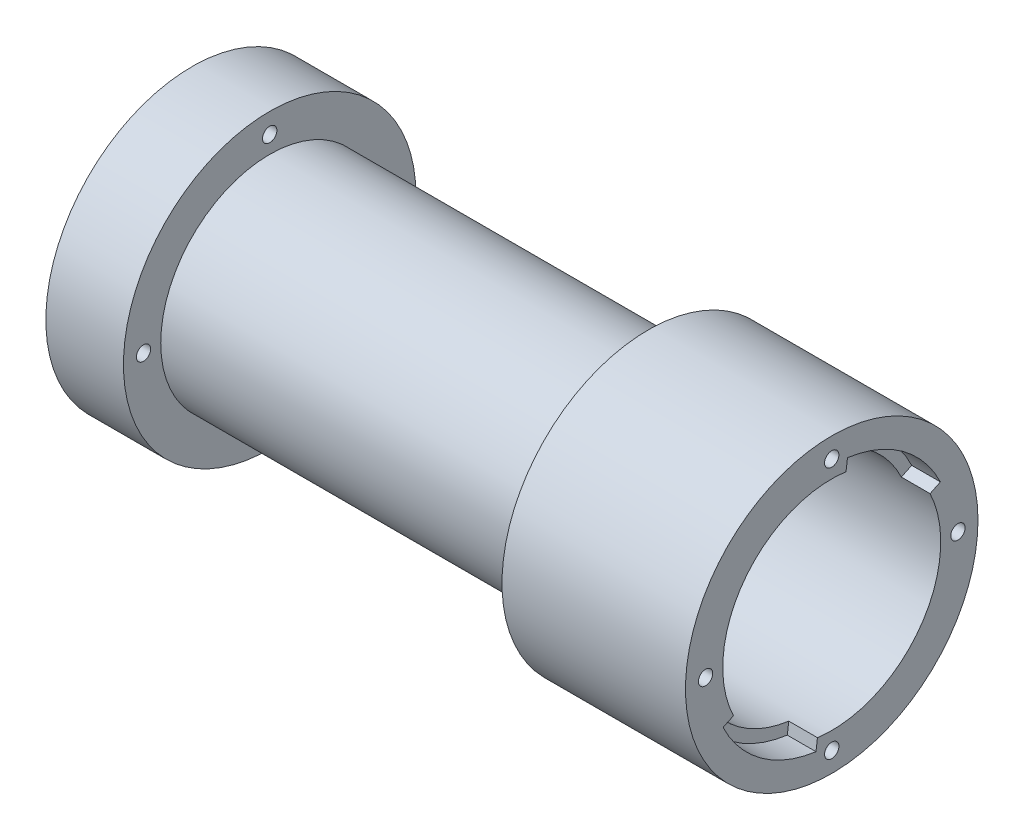
ISO-10303-21;
HEADER;
FILE_DESCRIPTION(('STEP AP214'),'2;1');
FILE_NAME('part.step','',(''),(''),'','','');
FILE_SCHEMA(('AUTOMOTIVE_DESIGN { 1 0 10303 214 1 1 1 1 }'));
ENDSEC;
DATA;
#1=APPLICATION_CONTEXT('core data for automotive mechanical design processes');
#2=APPLICATION_PROTOCOL_DEFINITION('international standard','automotive_design',2000,#1);
#3=PRODUCT_CONTEXT('',#1,'mechanical');
#4=PRODUCT('Part','Part','',(#3));
#5=PRODUCT_RELATED_PRODUCT_CATEGORY('part','',(#4));
#6=PRODUCT_DEFINITION_FORMATION('','',#4);
#7=PRODUCT_DEFINITION_CONTEXT('part definition',#1,'design');
#8=PRODUCT_DEFINITION('design','',#6,#7);
#9=PRODUCT_DEFINITION_SHAPE('','',#8);
#10=(LENGTH_UNIT() NAMED_UNIT(*) SI_UNIT(.MILLI.,.METRE.));
#11=(NAMED_UNIT(*) PLANE_ANGLE_UNIT() SI_UNIT($,.RADIAN.));
#12=(NAMED_UNIT(*) SI_UNIT($,.STERADIAN.) SOLID_ANGLE_UNIT());
#13=UNCERTAINTY_MEASURE_WITH_UNIT(LENGTH_MEASURE(1.E-05),#10,'distance_accuracy_value','');
#14=(GEOMETRIC_REPRESENTATION_CONTEXT(3) GLOBAL_UNCERTAINTY_ASSIGNED_CONTEXT((#13)) GLOBAL_UNIT_ASSIGNED_CONTEXT((#10,
#11,#12)) REPRESENTATION_CONTEXT('',''));
#15=CARTESIAN_POINT('',(0.,0.,0.));
#16=DIRECTION('',(0.,0.,1.));
#17=DIRECTION('',(1.,0.,0.));
#18=AXIS2_PLACEMENT_3D('',#15,#16,#17);
#19=CARTESIAN_POINT('',(213.98,0.,0.));
#20=DIRECTION('',(1.,0.,0.));
#21=DIRECTION('',(0.,0.,-1.));
#22=AXIS2_PLACEMENT_3D('',#19,#20,#21);
#23=PLANE('',#22);
#24=DIRECTION('',(0.,0.431627095776426,-0.902052132746));
#25=VECTOR('',#24,1.);
#26=CARTESIAN_POINT('',(213.98,16.4018296395042,-34.277981044348));
#27=LINE('',#26,#25);
#28=CARTESIAN_POINT('',(213.98,16.4018296395042,-34.277981044348));
#29=VERTEX_POINT('',#28);
#30=CARTESIAN_POINT('',(213.98,18.1283380226099,-37.886189575332));
#31=VERTEX_POINT('',#30);
#32=EDGE_CURVE('E134',#29,#31,#27,.T.);
#33=ORIENTED_EDGE('',*,*,#32,.F.);
#34=CARTESIAN_POINT('',(213.98,0.,0.));
#35=DIRECTION('',(1.,0.,0.));
#36=DIRECTION('',(0.,0.,-1.));
#37=AXIS2_PLACEMENT_3D('',#34,#35,#36);
#38=CIRCLE('',#37,38.);
#39=CARTESIAN_POINT('',(213.98,-37.6723908833809,4.9790526337609));
#40=VERTEX_POINT('',#39);
#41=EDGE_CURVE('E186',#40,#29,#38,.T.);
#42=ORIENTED_EDGE('',*,*,#41,.F.);
#43=DIRECTION('',(0.,0.991378707457392,-0.131027700888445));
#44=VECTOR('',#43,1.);
#45=CARTESIAN_POINT('',(213.98,-37.6723908833809,4.9790526337609));
#46=LINE('',#45,#44);
#47=CARTESIAN_POINT('',(213.98,-41.6379057132105,5.50316343731468));
#48=VERTEX_POINT('',#47);
#49=EDGE_CURVE('E160',#48,#40,#46,.T.);
#50=ORIENTED_EDGE('',*,*,#49,.F.);
#51=CARTESIAN_POINT('',(213.98,0.,0.));
#52=DIRECTION('',(1.,0.,0.));
#53=DIRECTION('',(0.,0.,1.));
#54=AXIS2_PLACEMENT_3D('',#51,#52,#53);
#55=CIRCLE('',#54,42.);
#56=CARTESIAN_POINT('',(213.98,-18.1283380226064,37.8861895753337));
#57=VERTEX_POINT('',#56);
#58=EDGE_CURVE('E152',#57,#48,#55,.T.);
#59=ORIENTED_EDGE('',*,*,#58,.F.);
#60=DIRECTION('',(0.,-0.431627095776342,0.90205213274604));
#61=VECTOR('',#60,1.);
#62=CARTESIAN_POINT('',(213.98,-16.401829639501,34.2779810443496));
#63=LINE('',#62,#61);
#64=CARTESIAN_POINT('',(213.98,-16.401829639501,34.2779810443496));
#65=VERTEX_POINT('',#64);
#66=EDGE_CURVE('E162',#65,#57,#63,.T.);
#67=ORIENTED_EDGE('',*,*,#66,.F.);
#68=CARTESIAN_POINT('',(213.98,37.6723908833813,-4.97905263375742));
#69=VERTEX_POINT('',#68);
#70=EDGE_CURVE('E189',#69,#65,#38,.T.);
#71=ORIENTED_EDGE('',*,*,#70,.F.);
#72=DIRECTION('',(0.,-0.991378707457404,0.131027700888353));
#73=VECTOR('',#72,1.);
#74=CARTESIAN_POINT('',(213.98,37.6723908833813,-4.97905263375742));
#75=LINE('',#74,#73);
#76=CARTESIAN_POINT('',(213.98,41.6379057132109,-5.50316343731083));
#77=VERTEX_POINT('',#76);
#78=EDGE_CURVE('E139',#77,#69,#75,.T.);
#79=ORIENTED_EDGE('',*,*,#78,.F.);
#80=CARTESIAN_POINT('',(213.98,0.,0.));
#81=DIRECTION('',(1.,0.,0.));
#82=DIRECTION('',(0.,0.,1.));
#83=AXIS2_PLACEMENT_3D('',#80,#81,#82);
#84=CIRCLE('',#83,42.);
#85=EDGE_CURVE('E119',#31,#77,#84,.T.);
#86=ORIENTED_EDGE('',*,*,#85,.F.);
#87=EDGE_LOOP('',(#33,#42,#50,#59,#67,#71,#79,#86));
#88=FACE_BOUND('',#87,.T.);
#89=CARTESIAN_POINT('',(213.98,44.,0.));
#90=DIRECTION('',(1.,0.,0.));
#91=DIRECTION('',(0.,0.,-1.));
#92=AXIS2_PLACEMENT_3D('',#89,#90,#91);
#93=CIRCLE('',#92,2.50000000000249);
#94=CARTESIAN_POINT('',(213.98,44.,-2.50000000000249));
#95=VERTEX_POINT('',#94);
#96=EDGE_CURVE('E174',#95,#95,#93,.F.);
#97=ORIENTED_EDGE('',*,*,#96,.T.);
#98=EDGE_LOOP('',(#97));
#99=FACE_BOUND('',#98,.T.);
#100=CARTESIAN_POINT('',(213.98,1.15794220585168E-12,44.0000000000012));
#101=DIRECTION('',(1.,0.,0.));
#102=DIRECTION('',(0.,0.,-1.));
#103=AXIS2_PLACEMENT_3D('',#100,#101,#102);
#104=CIRCLE('',#103,2.50000000000249);
#105=CARTESIAN_POINT('',(213.98,1.15794220585168E-12,41.4999999999987));
#106=VERTEX_POINT('',#105);
#107=EDGE_CURVE('E178',#106,#106,#104,.F.);
#108=ORIENTED_EDGE('',*,*,#107,.T.);
#109=EDGE_LOOP('',(#108));
#110=FACE_BOUND('',#109,.T.);
#111=CARTESIAN_POINT('',(213.98,-44.,2.31588441170336E-12));
#112=DIRECTION('',(1.,0.,0.));
#113=DIRECTION('',(0.,0.,-1.));
#114=AXIS2_PLACEMENT_3D('',#111,#112,#113);
#115=CIRCLE('',#114,2.50000000000249);
#116=CARTESIAN_POINT('',(213.98,-44.,-2.50000000000018));
#117=VERTEX_POINT('',#116);
#118=EDGE_CURVE('E181',#117,#117,#115,.F.);
#119=ORIENTED_EDGE('',*,*,#118,.T.);
#120=EDGE_LOOP('',(#119));
#121=FACE_BOUND('',#120,.T.);
#122=CARTESIAN_POINT('',(213.98,-1.16333065176793E-12,-43.9999999999988));
#123=DIRECTION('',(1.,0.,0.));
#124=DIRECTION('',(0.,0.,-1.));
#125=AXIS2_PLACEMENT_3D('',#122,#123,#124);
#126=CIRCLE('',#125,2.50000000000248);
#127=CARTESIAN_POINT('',(213.98,-1.16333065176793E-12,-46.5000000000013));
#128=VERTEX_POINT('',#127);
#129=EDGE_CURVE('E146',#128,#128,#126,.F.);
#130=ORIENTED_EDGE('',*,*,#129,.T.);
#131=EDGE_LOOP('',(#130));
#132=FACE_BOUND('',#131,.T.);
#133=CARTESIAN_POINT('',(213.98,0.,0.));
#134=DIRECTION('',(1.,0.,0.));
#135=DIRECTION('',(0.,0.,-1.));
#136=AXIS2_PLACEMENT_3D('',#133,#134,#135);
#137=CIRCLE('',#136,51.);
#138=CARTESIAN_POINT('',(213.98,0.,-51.));
#139=VERTEX_POINT('',#138);
#140=EDGE_CURVE('E12',#139,#139,#137,.T.);
#141=ORIENTED_EDGE('',*,*,#140,.T.);
#142=EDGE_LOOP('',(#141));
#143=FACE_BOUND('',#142,.T.);
#144=ADVANCED_FACE('F46',(#88,#99,#110,#121,#132,#143),#23,.T.);
#145=CARTESIAN_POINT('',(150.,0.,0.));
#146=DIRECTION('',(1.,0.,0.));
#147=DIRECTION('',(0.,0.,-1.));
#148=AXIS2_PLACEMENT_3D('',#145,#146,#147);
#149=PLANE('',#148);
#150=CARTESIAN_POINT('',(150.,44.,0.));
#151=DIRECTION('',(1.,0.,0.));
#152=DIRECTION('',(0.,0.,-1.));
#153=AXIS2_PLACEMENT_3D('',#150,#151,#152);
#154=CIRCLE('',#153,2.50000000000249);
#155=CARTESIAN_POINT('',(150.,44.,-2.50000000000249));
#156=VERTEX_POINT('',#155);
#157=EDGE_CURVE('E50',#156,#156,#154,.T.);
#158=ORIENTED_EDGE('',*,*,#157,.T.);
#159=EDGE_LOOP('',(#158));
#160=FACE_BOUND('',#159,.T.);
#161=CARTESIAN_POINT('',(150.,1.15794220585168E-12,44.0000000000012));
#162=DIRECTION('',(1.,0.,0.));
#163=DIRECTION('',(0.,0.,-1.));
#164=AXIS2_PLACEMENT_3D('',#161,#162,#163);
#165=CIRCLE('',#164,2.50000000000249);
#166=CARTESIAN_POINT('',(150.,1.15794220585168E-12,41.4999999999987));
#167=VERTEX_POINT('',#166);
#168=EDGE_CURVE('E199',#167,#167,#165,.T.);
#169=ORIENTED_EDGE('',*,*,#168,.T.);
#170=EDGE_LOOP('',(#169));
#171=FACE_BOUND('',#170,.T.);
#172=CARTESIAN_POINT('',(150.,-44.,2.31588441170336E-12));
#173=DIRECTION('',(1.,0.,0.));
#174=DIRECTION('',(0.,0.,-1.));
#175=AXIS2_PLACEMENT_3D('',#172,#173,#174);
#176=CIRCLE('',#175,2.50000000000249);
#177=CARTESIAN_POINT('',(150.,-44.,-2.50000000000018));
#178=VERTEX_POINT('',#177);
#179=EDGE_CURVE('E197',#178,#178,#176,.T.);
#180=ORIENTED_EDGE('',*,*,#179,.T.);
#181=EDGE_LOOP('',(#180));
#182=FACE_BOUND('',#181,.T.);
#183=CARTESIAN_POINT('',(150.,-1.16333065176793E-12,-43.9999999999988));
#184=DIRECTION('',(1.,0.,0.));
#185=DIRECTION('',(0.,0.,-1.));
#186=AXIS2_PLACEMENT_3D('',#183,#184,#185);
#187=CIRCLE('',#186,2.50000000000248);
#188=CARTESIAN_POINT('',(150.,-1.16333065176793E-12,-46.5000000000013));
#189=VERTEX_POINT('',#188);
#190=EDGE_CURVE('E177',#189,#189,#187,.T.);
#191=ORIENTED_EDGE('',*,*,#190,.T.);
#192=EDGE_LOOP('',(#191));
#193=FACE_BOUND('',#192,.T.);
#194=CARTESIAN_POINT('',(150.,0.,0.));
#195=DIRECTION('',(1.,0.,0.));
#196=DIRECTION('',(0.,0.,-1.));
#197=AXIS2_PLACEMENT_3D('',#194,#195,#196);
#198=CIRCLE('',#197,51.);
#199=CARTESIAN_POINT('',(150.,0.,-51.));
#200=VERTEX_POINT('',#199);
#201=EDGE_CURVE('E55',#200,#200,#198,.T.);
#202=ORIENTED_EDGE('',*,*,#201,.F.);
#203=EDGE_LOOP('',(#202));
#204=FACE_BOUND('',#203,.T.);
#205=CARTESIAN_POINT('',(150.,0.,0.));
#206=DIRECTION('',(1.,0.,0.));
#207=DIRECTION('',(0.,0.,-1.));
#208=AXIS2_PLACEMENT_3D('',#205,#206,#207);
#209=CIRCLE('',#208,38.);
#210=CARTESIAN_POINT('',(150.,0.,-38.));
#211=VERTEX_POINT('',#210);
#212=EDGE_CURVE('E190',#211,#211,#209,.T.);
#213=ORIENTED_EDGE('',*,*,#212,.T.);
#214=EDGE_LOOP('',(#213));
#215=FACE_BOUND('',#214,.T.);
#216=ADVANCED_FACE('F206',(#160,#171,#182,#193,#204,#215),#149,.F.);
#217=CARTESIAN_POINT('',(213.98,0.,0.));
#218=DIRECTION('',(-1.,0.,0.));
#219=DIRECTION('',(0.,0.,1.));
#220=AXIS2_PLACEMENT_3D('',#217,#218,#219);
#221=CYLINDRICAL_SURFACE('',#220,51.);
#222=ORIENTED_EDGE('',*,*,#140,.F.);
#223=EDGE_LOOP('',(#222));
#224=FACE_BOUND('',#223,.T.);
#225=ORIENTED_EDGE('',*,*,#201,.T.);
#226=EDGE_LOOP('',(#225));
#227=FACE_BOUND('',#226,.T.);
#228=ADVANCED_FACE('F48',(#224,#227),#221,.T.);
#229=CARTESIAN_POINT('',(213.98,0.,0.));
#230=DIRECTION('',(-1.,0.,0.));
#231=DIRECTION('',(0.,0.,1.));
#232=AXIS2_PLACEMENT_3D('',#229,#230,#231);
#233=CYLINDRICAL_SURFACE('',#232,38.);
#234=DIRECTION('',(1.,0.,0.));
#235=VECTOR('',#234,1.);
#236=CARTESIAN_POINT('',(203.98,16.4018296395042,-34.277981044348));
#237=LINE('',#236,#235);
#238=CARTESIAN_POINT('',(203.98,16.4018296395042,-34.277981044348));
#239=VERTEX_POINT('',#238);
#240=EDGE_CURVE('E147',#239,#29,#237,.T.);
#241=ORIENTED_EDGE('',*,*,#240,.F.);
#242=CARTESIAN_POINT('',(203.98,0.,0.));
#243=DIRECTION('',(-1.,0.,0.));
#244=DIRECTION('',(0.,0.,-1.));
#245=AXIS2_PLACEMENT_3D('',#242,#243,#244);
#246=CIRCLE('',#245,38.);
#247=CARTESIAN_POINT('',(203.98,37.6723908833813,-4.97905263375742));
#248=VERTEX_POINT('',#247);
#249=EDGE_CURVE('E128',#248,#239,#246,.T.);
#250=ORIENTED_EDGE('',*,*,#249,.F.);
#251=DIRECTION('',(1.,0.,0.));
#252=VECTOR('',#251,1.);
#253=CARTESIAN_POINT('',(203.98,37.6723908833813,-4.97905263375742));
#254=LINE('',#253,#252);
#255=EDGE_CURVE('E122',#248,#69,#254,.T.);
#256=ORIENTED_EDGE('',*,*,#255,.T.);
#257=ORIENTED_EDGE('',*,*,#70,.T.);
#258=DIRECTION('',(1.,0.,0.));
#259=VECTOR('',#258,1.);
#260=CARTESIAN_POINT('',(203.98,-16.401829639501,34.2779810443496));
#261=LINE('',#260,#259);
#262=CARTESIAN_POINT('',(203.98,-16.401829639501,34.2779810443496));
#263=VERTEX_POINT('',#262);
#264=EDGE_CURVE('E167',#263,#65,#261,.T.);
#265=ORIENTED_EDGE('',*,*,#264,.F.);
#266=CARTESIAN_POINT('',(203.98,0.,0.));
#267=DIRECTION('',(-1.,0.,0.));
#268=DIRECTION('',(0.,0.,-1.));
#269=AXIS2_PLACEMENT_3D('',#266,#267,#268);
#270=CIRCLE('',#269,38.);
#271=CARTESIAN_POINT('',(203.98,-37.6723908833809,4.9790526337609));
#272=VERTEX_POINT('',#271);
#273=EDGE_CURVE('E154',#272,#263,#270,.T.);
#274=ORIENTED_EDGE('',*,*,#273,.F.);
#275=DIRECTION('',(1.,0.,0.));
#276=VECTOR('',#275,1.);
#277=CARTESIAN_POINT('',(203.98,-37.6723908833809,4.9790526337609));
#278=LINE('',#277,#276);
#279=EDGE_CURVE('E169',#272,#40,#278,.T.);
#280=ORIENTED_EDGE('',*,*,#279,.T.);
#281=ORIENTED_EDGE('',*,*,#41,.T.);
#282=EDGE_LOOP('',(#241,#250,#256,#257,#265,#274,#280,#281));
#283=FACE_BOUND('',#282,.T.);
#284=ORIENTED_EDGE('',*,*,#212,.F.);
#285=EDGE_LOOP('',(#284));
#286=FACE_BOUND('',#285,.T.);
#287=ADVANCED_FACE('F235',(#283,#286),#233,.F.);
#288=CARTESIAN_POINT('',(221.051067811873,-1.16333065176793E-12,-43.9999999999988));
#289=DIRECTION('',(-1.,0.,0.));
#290=DIRECTION('',(0.,0.,1.));
#291=AXIS2_PLACEMENT_3D('',#288,#289,#290);
#292=CYLINDRICAL_SURFACE('',#291,2.50000000000248);
#293=ORIENTED_EDGE('',*,*,#129,.F.);
#294=EDGE_LOOP('',(#293));
#295=FACE_BOUND('',#294,.T.);
#296=ORIENTED_EDGE('',*,*,#190,.F.);
#297=EDGE_LOOP('',(#296));
#298=FACE_BOUND('',#297,.T.);
#299=ADVANCED_FACE('F238',(#295,#298),#292,.F.);
#300=CARTESIAN_POINT('',(221.051067811873,-44.,2.31588441170336E-12));
#301=DIRECTION('',(-1.,0.,0.));
#302=DIRECTION('',(0.,0.,1.));
#303=AXIS2_PLACEMENT_3D('',#300,#301,#302);
#304=CYLINDRICAL_SURFACE('',#303,2.50000000000249);
#305=ORIENTED_EDGE('',*,*,#118,.F.);
#306=EDGE_LOOP('',(#305));
#307=FACE_BOUND('',#306,.T.);
#308=ORIENTED_EDGE('',*,*,#179,.F.);
#309=EDGE_LOOP('',(#308));
#310=FACE_BOUND('',#309,.T.);
#311=ADVANCED_FACE('F221',(#307,#310),#304,.F.);
#312=CARTESIAN_POINT('',(221.051067811873,1.15794220585168E-12,44.0000000000012));
#313=DIRECTION('',(-1.,0.,0.));
#314=DIRECTION('',(0.,0.,1.));
#315=AXIS2_PLACEMENT_3D('',#312,#313,#314);
#316=CYLINDRICAL_SURFACE('',#315,2.50000000000249);
#317=ORIENTED_EDGE('',*,*,#107,.F.);
#318=EDGE_LOOP('',(#317));
#319=FACE_BOUND('',#318,.T.);
#320=ORIENTED_EDGE('',*,*,#168,.F.);
#321=EDGE_LOOP('',(#320));
#322=FACE_BOUND('',#321,.T.);
#323=ADVANCED_FACE('F211',(#319,#322),#316,.F.);
#324=CARTESIAN_POINT('',(221.051067811873,44.,0.));
#325=DIRECTION('',(-1.,0.,0.));
#326=DIRECTION('',(0.,0.,1.));
#327=AXIS2_PLACEMENT_3D('',#324,#325,#326);
#328=CYLINDRICAL_SURFACE('',#327,2.50000000000249);
#329=ORIENTED_EDGE('',*,*,#96,.F.);
#330=EDGE_LOOP('',(#329));
#331=FACE_BOUND('',#330,.T.);
#332=ORIENTED_EDGE('',*,*,#157,.F.);
#333=EDGE_LOOP('',(#332));
#334=FACE_BOUND('',#333,.T.);
#335=ADVANCED_FACE('F208',(#331,#334),#328,.F.);
#336=CARTESIAN_POINT('',(203.98,0.,0.));
#337=DIRECTION('',(1.,0.,0.));
#338=DIRECTION('',(0.,0.,-1.));
#339=AXIS2_PLACEMENT_3D('',#336,#337,#338);
#340=CYLINDRICAL_SURFACE('',#339,42.);
#341=ORIENTED_EDGE('',*,*,#58,.T.);
#342=DIRECTION('',(1.,0.,0.));
#343=VECTOR('',#342,1.);
#344=CARTESIAN_POINT('',(203.98,-41.6379057132105,5.50316343731468));
#345=LINE('',#344,#343);
#346=CARTESIAN_POINT('',(203.98,-41.6379057132105,5.50316343731468));
#347=VERTEX_POINT('',#346);
#348=EDGE_CURVE('E159',#347,#48,#345,.T.);
#349=ORIENTED_EDGE('',*,*,#348,.F.);
#350=CARTESIAN_POINT('',(203.98,0.,0.));
#351=DIRECTION('',(1.,0.,0.));
#352=DIRECTION('',(0.,0.,-1.));
#353=AXIS2_PLACEMENT_3D('',#350,#351,#352);
#354=CIRCLE('',#353,42.);
#355=CARTESIAN_POINT('',(203.98,-18.1283380226064,37.8861895753337));
#356=VERTEX_POINT('',#355);
#357=EDGE_CURVE('E150',#356,#347,#354,.T.);
#358=ORIENTED_EDGE('',*,*,#357,.F.);
#359=DIRECTION('',(1.,0.,0.));
#360=VECTOR('',#359,1.);
#361=CARTESIAN_POINT('',(203.98,-18.1283380226064,37.8861895753337));
#362=LINE('',#361,#360);
#363=EDGE_CURVE('E141',#356,#57,#362,.T.);
#364=ORIENTED_EDGE('',*,*,#363,.T.);
#365=EDGE_LOOP('',(#341,#349,#358,#364));
#366=FACE_BOUND('',#365,.T.);
#367=ADVANCED_FACE('F210',(#366),#340,.F.);
#368=CARTESIAN_POINT('',(203.98,-16.401829639501,34.2779810443496));
#369=DIRECTION('',(0.,0.902052132746041,0.431627095776342));
#370=DIRECTION('',(0.,-0.431627095776342,0.902052132746041));
#371=AXIS2_PLACEMENT_3D('',#368,#369,#370);
#372=PLANE('',#371);
#373=ORIENTED_EDGE('',*,*,#66,.T.);
#374=ORIENTED_EDGE('',*,*,#363,.F.);
#375=DIRECTION('',(0.,-0.431627095776342,0.90205213274604));
#376=VECTOR('',#375,1.);
#377=CARTESIAN_POINT('',(203.98,-16.401829639501,34.2779810443496));
#378=LINE('',#377,#376);
#379=EDGE_CURVE('E156',#263,#356,#378,.T.);
#380=ORIENTED_EDGE('',*,*,#379,.F.);
#381=ORIENTED_EDGE('',*,*,#264,.T.);
#382=EDGE_LOOP('',(#373,#374,#380,#381));
#383=FACE_BOUND('',#382,.T.);
#384=ADVANCED_FACE('F218',(#383),#372,.F.);
#385=CARTESIAN_POINT('',(203.98,-37.6723908833809,4.9790526337609));
#386=DIRECTION('',(0.,-0.131027700888445,-0.991378707457392));
#387=DIRECTION('',(0.,0.991378707457392,-0.131027700888445));
#388=AXIS2_PLACEMENT_3D('',#385,#386,#387);
#389=PLANE('',#388);
#390=ORIENTED_EDGE('',*,*,#49,.T.);
#391=ORIENTED_EDGE('',*,*,#279,.F.);
#392=DIRECTION('',(0.,0.991378707457392,-0.131027700888445));
#393=VECTOR('',#392,1.);
#394=CARTESIAN_POINT('',(203.98,-37.6723908833809,4.9790526337609));
#395=LINE('',#394,#393);
#396=EDGE_CURVE('E71',#347,#272,#395,.T.);
#397=ORIENTED_EDGE('',*,*,#396,.F.);
#398=ORIENTED_EDGE('',*,*,#348,.T.);
#399=EDGE_LOOP('',(#390,#391,#397,#398));
#400=FACE_BOUND('',#399,.T.);
#401=ADVANCED_FACE('F322',(#400),#389,.F.);
#402=CARTESIAN_POINT('',(203.98,0.,0.));
#403=DIRECTION('',(1.,0.,0.));
#404=DIRECTION('',(0.,0.,-1.));
#405=AXIS2_PLACEMENT_3D('',#402,#403,#404);
#406=PLANE('',#405);
#407=ORIENTED_EDGE('',*,*,#357,.T.);
#408=ORIENTED_EDGE('',*,*,#396,.T.);
#409=ORIENTED_EDGE('',*,*,#273,.T.);
#410=ORIENTED_EDGE('',*,*,#379,.T.);
#411=EDGE_LOOP('',(#407,#408,#409,#410));
#412=FACE_BOUND('',#411,.T.);
#413=ADVANCED_FACE('F331',(#412),#406,.T.);
#414=CARTESIAN_POINT('',(203.98,0.,0.));
#415=DIRECTION('',(1.,0.,0.));
#416=DIRECTION('',(0.,0.,-1.));
#417=AXIS2_PLACEMENT_3D('',#414,#415,#416);
#418=CYLINDRICAL_SURFACE('',#417,42.);
#419=ORIENTED_EDGE('',*,*,#85,.T.);
#420=DIRECTION('',(1.,0.,0.));
#421=VECTOR('',#420,1.);
#422=CARTESIAN_POINT('',(203.98,41.6379057132109,-5.50316343731083));
#423=LINE('',#422,#421);
#424=CARTESIAN_POINT('',(203.98,41.6379057132109,-5.50316343731083));
#425=VERTEX_POINT('',#424);
#426=EDGE_CURVE('E114',#425,#77,#423,.T.);
#427=ORIENTED_EDGE('',*,*,#426,.F.);
#428=CARTESIAN_POINT('',(203.98,0.,0.));
#429=DIRECTION('',(1.,0.,0.));
#430=DIRECTION('',(0.,0.,-1.));
#431=AXIS2_PLACEMENT_3D('',#428,#429,#430);
#432=CIRCLE('',#431,42.);
#433=CARTESIAN_POINT('',(203.98,18.1283380226099,-37.886189575332));
#434=VERTEX_POINT('',#433);
#435=EDGE_CURVE('E116',#434,#425,#432,.T.);
#436=ORIENTED_EDGE('',*,*,#435,.F.);
#437=DIRECTION('',(1.,0.,0.));
#438=VECTOR('',#437,1.);
#439=CARTESIAN_POINT('',(203.98,18.1283380226099,-37.886189575332));
#440=LINE('',#439,#438);
#441=EDGE_CURVE('E144',#434,#31,#440,.T.);
#442=ORIENTED_EDGE('',*,*,#441,.T.);
#443=EDGE_LOOP('',(#419,#427,#436,#442));
#444=FACE_BOUND('',#443,.T.);
#445=ADVANCED_FACE('F115',(#444),#418,.F.);
#446=CARTESIAN_POINT('',(203.98,16.4018296395042,-34.277981044348));
#447=DIRECTION('',(0.,-0.902052132746,-0.431627095776426));
#448=DIRECTION('',(0.,0.431627095776426,-0.902052132746));
#449=AXIS2_PLACEMENT_3D('',#446,#447,#448);
#450=PLANE('',#449);
#451=ORIENTED_EDGE('',*,*,#32,.T.);
#452=ORIENTED_EDGE('',*,*,#441,.F.);
#453=DIRECTION('',(0.,0.431627095776426,-0.902052132746));
#454=VECTOR('',#453,1.);
#455=CARTESIAN_POINT('',(203.98,16.4018296395042,-34.277981044348));
#456=LINE('',#455,#454);
#457=EDGE_CURVE('E123',#239,#434,#456,.T.);
#458=ORIENTED_EDGE('',*,*,#457,.F.);
#459=ORIENTED_EDGE('',*,*,#240,.T.);
#460=EDGE_LOOP('',(#451,#452,#458,#459));
#461=FACE_BOUND('',#460,.T.);
#462=ADVANCED_FACE('F346',(#461),#450,.F.);
#463=CARTESIAN_POINT('',(203.98,37.6723908833813,-4.97905263375742));
#464=DIRECTION('',(0.,0.131027700888353,0.991378707457404));
#465=DIRECTION('',(0.,-0.991378707457404,0.131027700888353));
#466=AXIS2_PLACEMENT_3D('',#463,#464,#465);
#467=PLANE('',#466);
#468=ORIENTED_EDGE('',*,*,#78,.T.);
#469=ORIENTED_EDGE('',*,*,#255,.F.);
#470=DIRECTION('',(0.,-0.991378707457404,0.131027700888353));
#471=VECTOR('',#470,1.);
#472=CARTESIAN_POINT('',(203.98,37.6723908833813,-4.97905263375742));
#473=LINE('',#472,#471);
#474=EDGE_CURVE('E63',#425,#248,#473,.T.);
#475=ORIENTED_EDGE('',*,*,#474,.F.);
#476=ORIENTED_EDGE('',*,*,#426,.T.);
#477=EDGE_LOOP('',(#468,#469,#475,#476));
#478=FACE_BOUND('',#477,.T.);
#479=ADVANCED_FACE('F125',(#478),#467,.F.);
#480=CARTESIAN_POINT('',(203.98,0.,0.));
#481=DIRECTION('',(1.,0.,0.));
#482=DIRECTION('',(0.,0.,-1.));
#483=AXIS2_PLACEMENT_3D('',#480,#481,#482);
#484=PLANE('',#483);
#485=ORIENTED_EDGE('',*,*,#435,.T.);
#486=ORIENTED_EDGE('',*,*,#474,.T.);
#487=ORIENTED_EDGE('',*,*,#249,.T.);
#488=ORIENTED_EDGE('',*,*,#457,.T.);
#489=EDGE_LOOP('',(#485,#486,#487,#488));
#490=FACE_BOUND('',#489,.T.);
#491=ADVANCED_FACE('F131',(#490),#484,.T.);
#492=CLOSED_SHELL('',(#144,#216,#228,#287,#299,#311,#323,#335,#367,#384,#401,#413,#445,#462,
#479,#491));
#493=MANIFOLD_SOLID_BREP('B2',#492);
#494=CARTESIAN_POINT('',(150.,0.,0.));
#495=DIRECTION('',(-1.,0.,0.));
#496=DIRECTION('',(0.,0.,1.));
#497=AXIS2_PLACEMENT_3D('',#494,#495,#496);
#498=CYLINDRICAL_SURFACE('',#497,27.);
#499=CARTESIAN_POINT('',(18.,0.,0.));
#500=DIRECTION('',(1.,0.,0.));
#501=DIRECTION('',(0.,0.,-1.));
#502=AXIS2_PLACEMENT_3D('',#499,#500,#501);
#503=CIRCLE('',#502,27.);
#504=CARTESIAN_POINT('',(18.,0.,-27.));
#505=VERTEX_POINT('',#504);
#506=EDGE_CURVE('E432',#505,#505,#503,.T.);
#507=ORIENTED_EDGE('',*,*,#506,.F.);
#508=EDGE_LOOP('',(#507));
#509=FACE_BOUND('',#508,.T.);
#510=CARTESIAN_POINT('',(136.,0.,0.));
#511=DIRECTION('',(1.,0.,0.));
#512=DIRECTION('',(0.,0.,-1.));
#513=AXIS2_PLACEMENT_3D('',#510,#511,#512);
#514=CIRCLE('',#513,27.);
#515=CARTESIAN_POINT('',(136.,0.,-27.));
#516=VERTEX_POINT('',#515);
#517=EDGE_CURVE('E408',#516,#516,#514,.T.);
#518=ORIENTED_EDGE('',*,*,#517,.T.);
#519=EDGE_LOOP('',(#518));
#520=FACE_BOUND('',#519,.T.);
#521=ADVANCED_FACE('F404',(#509,#520),#498,.F.);
#522=CARTESIAN_POINT('',(-9.06,0.,0.));
#523=DIRECTION('',(1.,0.,0.));
#524=DIRECTION('',(0.,0.,-1.));
#525=AXIS2_PLACEMENT_3D('',#522,#523,#524);
#526=CYLINDRICAL_SURFACE('',#525,51.);
#527=CARTESIAN_POINT('',(-9.06,0.,0.));
#528=DIRECTION('',(1.,0.,0.));
#529=DIRECTION('',(0.,0.,-1.));
#530=AXIS2_PLACEMENT_3D('',#527,#528,#529);
#531=CIRCLE('',#530,51.);
#532=CARTESIAN_POINT('',(-9.06,0.,-51.));
#533=VERTEX_POINT('',#532);
#534=EDGE_CURVE('E45',#533,#533,#531,.T.);
#535=ORIENTED_EDGE('',*,*,#534,.T.);
#536=EDGE_LOOP('',(#535));
#537=FACE_BOUND('',#536,.T.);
#538=CARTESIAN_POINT('',(18.,0.,0.));
#539=DIRECTION('',(1.,0.,0.));
#540=DIRECTION('',(0.,0.,-1.));
#541=AXIS2_PLACEMENT_3D('',#538,#539,#540);
#542=CIRCLE('',#541,51.);
#543=CARTESIAN_POINT('',(18.,0.,-51.));
#544=VERTEX_POINT('',#543);
#545=EDGE_CURVE('E417',#544,#544,#542,.T.);
#546=ORIENTED_EDGE('',*,*,#545,.F.);
#547=EDGE_LOOP('',(#546));
#548=FACE_BOUND('',#547,.T.);
#549=ADVANCED_FACE('F406',(#537,#548),#526,.T.);
#550=CARTESIAN_POINT('',(-9.06,0.,0.));
#551=DIRECTION('',(1.,0.,0.));
#552=DIRECTION('',(0.,0.,-1.));
#553=AXIS2_PLACEMENT_3D('',#550,#551,#552);
#554=PLANE('',#553);
#555=CARTESIAN_POINT('',(-9.06,44.,0.));
#556=DIRECTION('',(-1.,0.,0.));
#557=DIRECTION('',(0.,0.,1.));
#558=AXIS2_PLACEMENT_3D('',#555,#556,#557);
#559=CIRCLE('',#558,2.50000000000249);
#560=CARTESIAN_POINT('',(-9.06,44.,2.50000000000249));
#561=VERTEX_POINT('',#560);
#562=EDGE_CURVE('E425',#561,#561,#559,.T.);
#563=ORIENTED_EDGE('',*,*,#562,.F.);
#564=EDGE_LOOP('',(#563));
#565=FACE_BOUND('',#564,.T.);
#566=CARTESIAN_POINT('',(-9.06,1.15794220585168E-12,44.0000000000012));
#567=DIRECTION('',(-1.,0.,0.));
#568=DIRECTION('',(0.,0.,1.));
#569=AXIS2_PLACEMENT_3D('',#566,#567,#568);
#570=CIRCLE('',#569,2.50000000000249);
#571=CARTESIAN_POINT('',(-9.06,1.15794220585168E-12,46.5000000000037));
#572=VERTEX_POINT('',#571);
#573=EDGE_CURVE('E608',#572,#572,#570,.T.);
#574=ORIENTED_EDGE('',*,*,#573,.F.);
#575=EDGE_LOOP('',(#574));
#576=FACE_BOUND('',#575,.T.);
#577=CARTESIAN_POINT('',(-9.06,-44.,2.31588441170336E-12));
#578=DIRECTION('',(-1.,0.,0.));
#579=DIRECTION('',(0.,0.,1.));
#580=AXIS2_PLACEMENT_3D('',#577,#578,#579);
#581=CIRCLE('',#580,2.50000000000249);
#582=CARTESIAN_POINT('',(-9.06,-44.,2.50000000000481));
#583=VERTEX_POINT('',#582);
#584=EDGE_CURVE('E610',#583,#583,#581,.T.);
#585=ORIENTED_EDGE('',*,*,#584,.F.);
#586=EDGE_LOOP('',(#585));
#587=FACE_BOUND('',#586,.T.);
#588=CARTESIAN_POINT('',(-9.06,-1.16333065176793E-12,-43.9999999999988));
#589=DIRECTION('',(-1.,0.,0.));
#590=DIRECTION('',(0.,0.,1.));
#591=AXIS2_PLACEMENT_3D('',#588,#589,#590);
#592=CIRCLE('',#591,2.50000000000248);
#593=CARTESIAN_POINT('',(-9.06,-1.16333065176793E-12,-41.4999999999964));
#594=VERTEX_POINT('',#593);
#595=EDGE_CURVE('E445',#594,#594,#592,.T.);
#596=ORIENTED_EDGE('',*,*,#595,.F.);
#597=EDGE_LOOP('',(#596));
#598=FACE_BOUND('',#597,.T.);
#599=CARTESIAN_POINT('',(-9.06,0.,0.));
#600=DIRECTION('',(1.,0.,0.));
#601=DIRECTION('',(0.,0.,-1.));
#602=AXIS2_PLACEMENT_3D('',#599,#600,#601);
#603=CIRCLE('',#602,31.);
#604=CARTESIAN_POINT('',(-9.06,0.,-31.));
#605=VERTEX_POINT('',#604);
#606=EDGE_CURVE('E412',#605,#605,#603,.T.);
#607=ORIENTED_EDGE('',*,*,#606,.T.);
#608=EDGE_LOOP('',(#607));
#609=FACE_BOUND('',#608,.T.);
#610=ORIENTED_EDGE('',*,*,#534,.F.);
#611=EDGE_LOOP('',(#610));
#612=FACE_BOUND('',#611,.T.);
#613=ADVANCED_FACE('F457',(#565,#576,#587,#598,#609,#612),#554,.F.);
#614=CARTESIAN_POINT('',(-9.06,0.,0.));
#615=DIRECTION('',(1.,0.,0.));
#616=DIRECTION('',(0.,0.,-1.));
#617=AXIS2_PLACEMENT_3D('',#614,#615,#616);
#618=CYLINDRICAL_SURFACE('',#617,31.);
#619=ORIENTED_EDGE('',*,*,#606,.F.);
#620=EDGE_LOOP('',(#619));
#621=FACE_BOUND('',#620,.T.);
#622=CARTESIAN_POINT('',(18.,0.,0.));
#623=DIRECTION('',(1.,0.,0.));
#624=DIRECTION('',(0.,0.,-1.));
#625=AXIS2_PLACEMENT_3D('',#622,#623,#624);
#626=CIRCLE('',#625,31.);
#627=CARTESIAN_POINT('',(18.,0.,-31.));
#628=VERTEX_POINT('',#627);
#629=EDGE_CURVE('E448',#628,#628,#626,.F.);
#630=ORIENTED_EDGE('',*,*,#629,.F.);
#631=EDGE_LOOP('',(#630));
#632=FACE_BOUND('',#631,.T.);
#633=ADVANCED_FACE('F462',(#621,#632),#618,.F.);
#634=CARTESIAN_POINT('',(18.,0.,0.));
#635=DIRECTION('',(1.,0.,0.));
#636=DIRECTION('',(0.,0.,-1.));
#637=AXIS2_PLACEMENT_3D('',#634,#635,#636);
#638=PLANE('',#637);
#639=CARTESIAN_POINT('',(18.,44.,0.));
#640=DIRECTION('',(1.,0.,0.));
#641=DIRECTION('',(0.,0.,-1.));
#642=AXIS2_PLACEMENT_3D('',#639,#640,#641);
#643=CIRCLE('',#642,2.50000000000249);
#644=CARTESIAN_POINT('',(18.,44.,-2.50000000000249));
#645=VERTEX_POINT('',#644);
#646=EDGE_CURVE('E430',#645,#645,#643,.T.);
#647=ORIENTED_EDGE('',*,*,#646,.F.);
#648=EDGE_LOOP('',(#647));
#649=FACE_BOUND('',#648,.T.);
#650=CARTESIAN_POINT('',(18.,1.15794220585168E-12,44.0000000000012));
#651=DIRECTION('',(1.,0.,0.));
#652=DIRECTION('',(0.,0.,-1.));
#653=AXIS2_PLACEMENT_3D('',#650,#651,#652);
#654=CIRCLE('',#653,2.50000000000249);
#655=CARTESIAN_POINT('',(18.,1.15794220585168E-12,41.4999999999987));
#656=VERTEX_POINT('',#655);
#657=EDGE_CURVE('E428',#656,#656,#654,.T.);
#658=ORIENTED_EDGE('',*,*,#657,.F.);
#659=EDGE_LOOP('',(#658));
#660=FACE_BOUND('',#659,.T.);
#661=CARTESIAN_POINT('',(18.,-44.,2.31588441170336E-12));
#662=DIRECTION('',(1.,0.,0.));
#663=DIRECTION('',(0.,0.,-1.));
#664=AXIS2_PLACEMENT_3D('',#661,#662,#663);
#665=CIRCLE('',#664,2.50000000000249);
#666=CARTESIAN_POINT('',(18.,-44.,-2.50000000000018));
#667=VERTEX_POINT('',#666);
#668=EDGE_CURVE('E424',#667,#667,#665,.T.);
#669=ORIENTED_EDGE('',*,*,#668,.F.);
#670=EDGE_LOOP('',(#669));
#671=FACE_BOUND('',#670,.T.);
#672=CARTESIAN_POINT('',(18.,-1.16333065176793E-12,-43.9999999999988));
#673=DIRECTION('',(1.,0.,0.));
#674=DIRECTION('',(0.,0.,-1.));
#675=AXIS2_PLACEMENT_3D('',#672,#673,#674);
#676=CIRCLE('',#675,2.50000000000248);
#677=CARTESIAN_POINT('',(18.,-1.16333065176793E-12,-46.5000000000013));
#678=VERTEX_POINT('',#677);
#679=EDGE_CURVE('E421',#678,#678,#676,.T.);
#680=ORIENTED_EDGE('',*,*,#679,.F.);
#681=EDGE_LOOP('',(#680));
#682=FACE_BOUND('',#681,.T.);
#683=CARTESIAN_POINT('',(18.,0.,0.));
#684=DIRECTION('',(1.,0.,0.));
#685=DIRECTION('',(0.,0.,-1.));
#686=AXIS2_PLACEMENT_3D('',#683,#684,#685);
#687=CIRCLE('',#686,38.);
#688=CARTESIAN_POINT('',(18.,0.,-38.));
#689=VERTEX_POINT('',#688);
#690=EDGE_CURVE('E436',#689,#689,#687,.T.);
#691=ORIENTED_EDGE('',*,*,#690,.F.);
#692=EDGE_LOOP('',(#691));
#693=FACE_BOUND('',#692,.T.);
#694=ORIENTED_EDGE('',*,*,#545,.T.);
#695=EDGE_LOOP('',(#694));
#696=FACE_BOUND('',#695,.T.);
#697=ADVANCED_FACE('F454',(#649,#660,#671,#682,#693,#696),#638,.T.);
#698=CARTESIAN_POINT('',(18.,0.,0.));
#699=DIRECTION('',(1.,0.,0.));
#700=DIRECTION('',(0.,0.,-1.));
#701=AXIS2_PLACEMENT_3D('',#698,#699,#700);
#702=PLANE('',#701);
#703=ORIENTED_EDGE('',*,*,#506,.T.);
#704=EDGE_LOOP('',(#703));
#705=FACE_BOUND('',#704,.T.);
#706=ORIENTED_EDGE('',*,*,#629,.T.);
#707=EDGE_LOOP('',(#706));
#708=FACE_BOUND('',#707,.T.);
#709=ADVANCED_FACE('F477',(#705,#708),#702,.F.);
#710=CARTESIAN_POINT('',(150.,0.,0.));
#711=DIRECTION('',(1.,0.,0.));
#712=DIRECTION('',(0.,0.,-1.));
#713=AXIS2_PLACEMENT_3D('',#710,#711,#712);
#714=PLANE('',#713);
#715=CARTESIAN_POINT('',(150.,0.,0.));
#716=DIRECTION('',(1.,0.,0.));
#717=DIRECTION('',(0.,0.,-1.));
#718=AXIS2_PLACEMENT_3D('',#715,#716,#717);
#719=CIRCLE('',#718,31.);
#720=CARTESIAN_POINT('',(150.,0.,-31.));
#721=VERTEX_POINT('',#720);
#722=EDGE_CURVE('E601',#721,#721,#719,.T.);
#723=ORIENTED_EDGE('',*,*,#722,.F.);
#724=EDGE_LOOP('',(#723));
#725=FACE_BOUND('',#724,.T.);
#726=CARTESIAN_POINT('',(150.,0.,0.));
#727=DIRECTION('',(1.,0.,0.));
#728=DIRECTION('',(0.,0.,-1.));
#729=AXIS2_PLACEMENT_3D('',#726,#727,#728);
#730=CIRCLE('',#729,38.);
#731=CARTESIAN_POINT('',(150.,0.,-38.));
#732=VERTEX_POINT('',#731);
#733=EDGE_CURVE('E441',#732,#732,#730,.T.);
#734=ORIENTED_EDGE('',*,*,#733,.T.);
#735=EDGE_LOOP('',(#734));
#736=FACE_BOUND('',#735,.T.);
#737=ADVANCED_FACE('F473',(#725,#736),#714,.T.);
#738=CARTESIAN_POINT('',(150.,0.,0.));
#739=DIRECTION('',(-1.,0.,0.));
#740=DIRECTION('',(0.,0.,1.));
#741=AXIS2_PLACEMENT_3D('',#738,#739,#740);
#742=CYLINDRICAL_SURFACE('',#741,38.);
#743=ORIENTED_EDGE('',*,*,#733,.F.);
#744=EDGE_LOOP('',(#743));
#745=FACE_BOUND('',#744,.T.);
#746=ORIENTED_EDGE('',*,*,#690,.T.);
#747=EDGE_LOOP('',(#746));
#748=FACE_BOUND('',#747,.T.);
#749=ADVANCED_FACE('F476',(#745,#748),#742,.T.);
#750=CARTESIAN_POINT('',(221.051067811873,-1.16333065176793E-12,-43.9999999999988));
#751=DIRECTION('',(-1.,0.,0.));
#752=DIRECTION('',(0.,0.,1.));
#753=AXIS2_PLACEMENT_3D('',#750,#751,#752);
#754=CYLINDRICAL_SURFACE('',#753,2.50000000000248);
#755=ORIENTED_EDGE('',*,*,#679,.T.);
#756=EDGE_LOOP('',(#755));
#757=FACE_BOUND('',#756,.T.);
#758=ORIENTED_EDGE('',*,*,#595,.T.);
#759=EDGE_LOOP('',(#758));
#760=FACE_BOUND('',#759,.T.);
#761=ADVANCED_FACE('F471',(#757,#760),#754,.F.);
#762=CARTESIAN_POINT('',(221.051067811873,-44.,2.31588441170336E-12));
#763=DIRECTION('',(-1.,0.,0.));
#764=DIRECTION('',(0.,0.,1.));
#765=AXIS2_PLACEMENT_3D('',#762,#763,#764);
#766=CYLINDRICAL_SURFACE('',#765,2.50000000000249);
#767=ORIENTED_EDGE('',*,*,#668,.T.);
#768=EDGE_LOOP('',(#767));
#769=FACE_BOUND('',#768,.T.);
#770=ORIENTED_EDGE('',*,*,#584,.T.);
#771=EDGE_LOOP('',(#770));
#772=FACE_BOUND('',#771,.T.);
#773=ADVANCED_FACE('F522',(#769,#772),#766,.F.);
#774=CARTESIAN_POINT('',(221.051067811873,1.15794220585168E-12,44.0000000000012));
#775=DIRECTION('',(-1.,0.,0.));
#776=DIRECTION('',(0.,0.,1.));
#777=AXIS2_PLACEMENT_3D('',#774,#775,#776);
#778=CYLINDRICAL_SURFACE('',#777,2.50000000000249);
#779=ORIENTED_EDGE('',*,*,#657,.T.);
#780=EDGE_LOOP('',(#779));
#781=FACE_BOUND('',#780,.T.);
#782=ORIENTED_EDGE('',*,*,#573,.T.);
#783=EDGE_LOOP('',(#782));
#784=FACE_BOUND('',#783,.T.);
#785=ADVANCED_FACE('F529',(#781,#784),#778,.F.);
#786=CARTESIAN_POINT('',(221.051067811873,44.,0.));
#787=DIRECTION('',(-1.,0.,0.));
#788=DIRECTION('',(0.,0.,1.));
#789=AXIS2_PLACEMENT_3D('',#786,#787,#788);
#790=CYLINDRICAL_SURFACE('',#789,2.50000000000249);
#791=ORIENTED_EDGE('',*,*,#646,.T.);
#792=EDGE_LOOP('',(#791));
#793=FACE_BOUND('',#792,.T.);
#794=ORIENTED_EDGE('',*,*,#562,.T.);
#795=EDGE_LOOP('',(#794));
#796=FACE_BOUND('',#795,.T.);
#797=ADVANCED_FACE('F536',(#793,#796),#790,.F.);
#798=CARTESIAN_POINT('',(136.,0.,0.));
#799=DIRECTION('',(1.,0.,0.));
#800=DIRECTION('',(0.,0.,-1.));
#801=AXIS2_PLACEMENT_3D('',#798,#799,#800);
#802=CYLINDRICAL_SURFACE('',#801,31.);
#803=CARTESIAN_POINT('',(136.,0.,0.));
#804=DIRECTION('',(1.,0.,0.));
#805=DIRECTION('',(0.,0.,-1.));
#806=AXIS2_PLACEMENT_3D('',#803,#804,#805);
#807=CIRCLE('',#806,31.);
#808=CARTESIAN_POINT('',(136.,0.,-31.));
#809=VERTEX_POINT('',#808);
#810=EDGE_CURVE('E600',#809,#809,#807,.T.);
#811=ORIENTED_EDGE('',*,*,#810,.F.);
#812=EDGE_LOOP('',(#811));
#813=FACE_BOUND('',#812,.T.);
#814=ORIENTED_EDGE('',*,*,#722,.T.);
#815=EDGE_LOOP('',(#814));
#816=FACE_BOUND('',#815,.T.);
#817=ADVANCED_FACE('F544',(#813,#816),#802,.F.);
#818=CARTESIAN_POINT('',(136.,0.,0.));
#819=DIRECTION('',(1.,0.,0.));
#820=DIRECTION('',(0.,0.,-1.));
#821=AXIS2_PLACEMENT_3D('',#818,#819,#820);
#822=PLANE('',#821);
#823=ORIENTED_EDGE('',*,*,#517,.F.);
#824=EDGE_LOOP('',(#823));
#825=FACE_BOUND('',#824,.T.);
#826=ORIENTED_EDGE('',*,*,#810,.T.);
#827=EDGE_LOOP('',(#826));
#828=FACE_BOUND('',#827,.T.);
#829=ADVANCED_FACE('F550',(#825,#828),#822,.T.);
#830=CLOSED_SHELL('',(#521,#549,#613,#633,#697,#709,#737,#749,#761,#773,#785,#797,#817,#829));
#831=MANIFOLD_SOLID_BREP('B6',#830);
#832=ADVANCED_BREP_SHAPE_REPRESENTATION('',(#18,#493,#831),#14);
#833=SHAPE_DEFINITION_REPRESENTATION(#9,#832);
ENDSEC;
END-ISO-10303-21;
